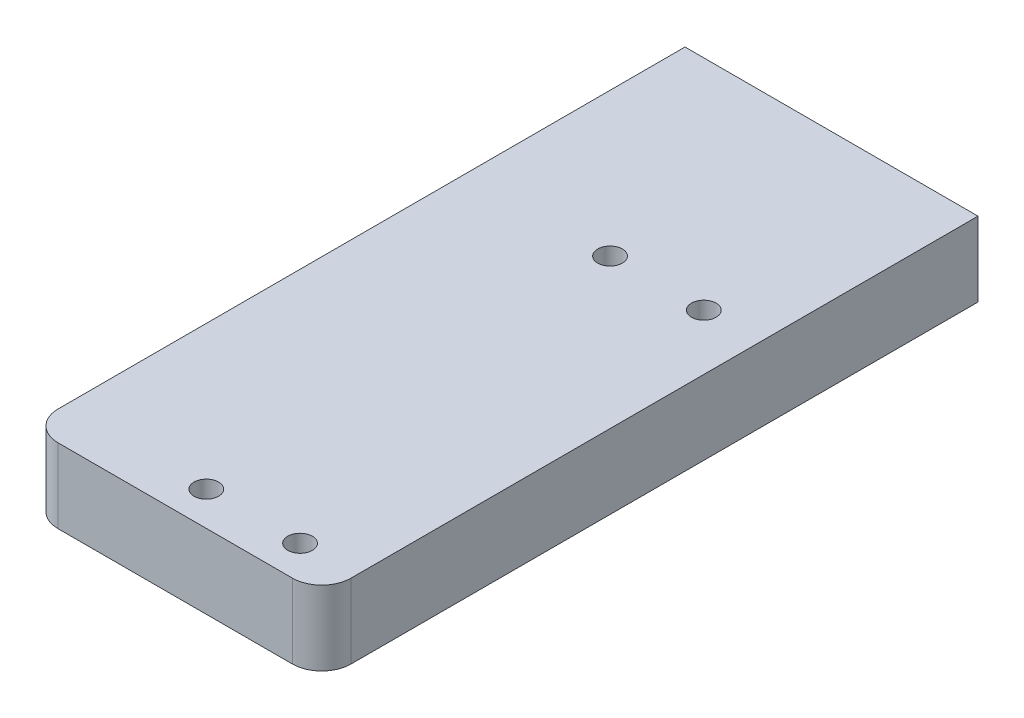
ISO-10303-21;
HEADER;
FILE_DESCRIPTION(('STEP AP214'),'2;1');
FILE_NAME('part.step','',(''),(''),'','','');
FILE_SCHEMA(('AUTOMOTIVE_DESIGN { 1 0 10303 214 1 1 1 1 }'));
ENDSEC;
DATA;
#1=APPLICATION_CONTEXT('core data for automotive mechanical design processes');
#2=APPLICATION_PROTOCOL_DEFINITION('international standard','automotive_design',2000,#1);
#3=PRODUCT_CONTEXT('',#1,'mechanical');
#4=PRODUCT('Part','Part','',(#3));
#5=PRODUCT_RELATED_PRODUCT_CATEGORY('part','',(#4));
#6=PRODUCT_DEFINITION_FORMATION('','',#4);
#7=PRODUCT_DEFINITION_CONTEXT('part definition',#1,'design');
#8=PRODUCT_DEFINITION('design','',#6,#7);
#9=PRODUCT_DEFINITION_SHAPE('','',#8);
#10=(LENGTH_UNIT() NAMED_UNIT(*) SI_UNIT(.MILLI.,.METRE.));
#11=(NAMED_UNIT(*) PLANE_ANGLE_UNIT() SI_UNIT($,.RADIAN.));
#12=(NAMED_UNIT(*) SI_UNIT($,.STERADIAN.) SOLID_ANGLE_UNIT());
#13=UNCERTAINTY_MEASURE_WITH_UNIT(LENGTH_MEASURE(1.E-05),#10,'distance_accuracy_value','');
#14=(GEOMETRIC_REPRESENTATION_CONTEXT(3) GLOBAL_UNCERTAINTY_ASSIGNED_CONTEXT((#13)) GLOBAL_UNIT_ASSIGNED_CONTEXT((#10,
#11,#12)) REPRESENTATION_CONTEXT('',''));
#15=CARTESIAN_POINT('',(0.,0.,0.));
#16=DIRECTION('',(0.,0.,1.));
#17=DIRECTION('',(1.,0.,0.));
#18=AXIS2_PLACEMENT_3D('',#15,#16,#17);
#19=CARTESIAN_POINT('',(-25.,-6.35000000000008,112.));
#20=DIRECTION('',(0.,1.00000000000002,0.));
#21=DIRECTION('',(0.,0.,1.));
#22=AXIS2_PLACEMENT_3D('',#19,#20,#21);
#23=PLANE('',#22);
#24=DIRECTION('',(1.00000000000002,0.,0.));
#25=VECTOR('',#24,1.);
#26=CARTESIAN_POINT('',(-25.,-6.35000000000008,112.));
#27=LINE('',#26,#25);
#28=CARTESIAN_POINT('',(-20.,-6.35000000000008,112.));
#29=VERTEX_POINT('',#28);
#30=CARTESIAN_POINT('',(20.,-6.35000000000008,112.));
#31=VERTEX_POINT('',#30);
#32=EDGE_CURVE('E192',#29,#31,#27,.T.);
#33=ORIENTED_EDGE('',*,*,#32,.F.);
#34=CARTESIAN_POINT('',(-20.,-6.35000000000008,107.));
#35=DIRECTION('',(0.,1.00000000000002,0.));
#36=DIRECTION('',(0.,0.,1.));
#37=AXIS2_PLACEMENT_3D('',#34,#35,#36);
#38=CIRCLE('',#37,5.);
#39=CARTESIAN_POINT('',(-25.,-6.35000000000008,107.));
#40=VERTEX_POINT('',#39);
#41=EDGE_CURVE('E222',#29,#40,#38,.F.);
#42=ORIENTED_EDGE('',*,*,#41,.T.);
#43=DIRECTION('',(0.,0.,-1.));
#44=VECTOR('',#43,1.);
#45=CARTESIAN_POINT('',(-25.,-6.35000000000008,112.));
#46=LINE('',#45,#44);
#47=CARTESIAN_POINT('',(-24.9999999999969,-6.35000000000008,-3.10862446895044E-12));
#48=VERTEX_POINT('',#47);
#49=EDGE_CURVE('E208',#40,#48,#46,.T.);
#50=ORIENTED_EDGE('',*,*,#49,.T.);
#51=DIRECTION('',(1.00000000000002,0.,0.));
#52=VECTOR('',#51,1.);
#53=CARTESIAN_POINT('',(-24.9999999999969,-6.35000000000008,-3.10862446895044E-12));
#54=LINE('',#53,#52);
#55=CARTESIAN_POINT('',(25.0000000000031,-6.35000000000008,0.));
#56=VERTEX_POINT('',#55);
#57=EDGE_CURVE('E193',#48,#56,#54,.T.);
#58=ORIENTED_EDGE('',*,*,#57,.T.);
#59=DIRECTION('',(0.,0.,-1.));
#60=VECTOR('',#59,1.);
#61=CARTESIAN_POINT('',(25.0000000000001,-6.35000000000008,112.));
#62=LINE('',#61,#60);
#63=CARTESIAN_POINT('',(25.0000000000031,-6.35000000000008,107.));
#64=VERTEX_POINT('',#63);
#65=EDGE_CURVE('E196',#64,#56,#62,.T.);
#66=ORIENTED_EDGE('',*,*,#65,.F.);
#67=CARTESIAN_POINT('',(20.0000000000031,-6.35000000000008,107.));
#68=DIRECTION('',(0.,1.00000000000002,0.));
#69=DIRECTION('',(0.,0.,1.));
#70=AXIS2_PLACEMENT_3D('',#67,#68,#69);
#71=CIRCLE('',#70,5.);
#72=EDGE_CURVE('E220',#64,#31,#71,.F.);
#73=ORIENTED_EDGE('',*,*,#72,.T.);
#74=EDGE_LOOP('',(#33,#42,#50,#58,#66,#73));
#75=FACE_BOUND('',#74,.T.);
#76=CARTESIAN_POINT('',(-0.499999999997613,-6.35000000000008,106.200000000001));
#77=DIRECTION('',(0.,1.00000000000002,0.));
#78=DIRECTION('',(0.,0.,1.));
#79=AXIS2_PLACEMENT_3D('',#76,#77,#78);
#80=CIRCLE('',#79,2.1);
#81=CARTESIAN_POINT('',(-0.499999999997613,-6.35000000000008,108.300000000001));
#82=VERTEX_POINT('',#81);
#83=EDGE_CURVE('E176',#82,#82,#80,.T.);
#84=ORIENTED_EDGE('',*,*,#83,.T.);
#85=EDGE_LOOP('',(#84));
#86=FACE_BOUND('',#85,.T.);
#87=CARTESIAN_POINT('',(15.5000000000055,-6.35000000000008,106.200000000001));
#88=DIRECTION('',(0.,1.00000000000002,0.));
#89=DIRECTION('',(0.,0.,1.));
#90=AXIS2_PLACEMENT_3D('',#87,#88,#89);
#91=CIRCLE('',#90,2.1);
#92=CARTESIAN_POINT('',(15.5000000000055,-6.35000000000008,108.300000000001));
#93=VERTEX_POINT('',#92);
#94=EDGE_CURVE('E310',#93,#93,#91,.T.);
#95=ORIENTED_EDGE('',*,*,#94,.T.);
#96=EDGE_LOOP('',(#95));
#97=FACE_BOUND('',#96,.T.);
#98=CARTESIAN_POINT('',(15.5000000000023,-6.35000000000008,37.3000000000008));
#99=DIRECTION('',(0.,1.00000000000002,0.));
#100=DIRECTION('',(0.,0.,1.));
#101=AXIS2_PLACEMENT_3D('',#98,#99,#100);
#102=CIRCLE('',#101,2.1);
#103=CARTESIAN_POINT('',(15.5000000000023,-6.35000000000008,39.4000000000008));
#104=VERTEX_POINT('',#103);
#105=EDGE_CURVE('E304',#104,#104,#102,.T.);
#106=ORIENTED_EDGE('',*,*,#105,.T.);
#107=EDGE_LOOP('',(#106));
#108=FACE_BOUND('',#107,.T.);
#109=CARTESIAN_POINT('',(-0.499999999997613,-6.35000000000008,37.3000000000007));
#110=DIRECTION('',(0.,1.00000000000002,0.));
#111=DIRECTION('',(0.,0.,1.));
#112=AXIS2_PLACEMENT_3D('',#109,#110,#111);
#113=CIRCLE('',#112,2.1);
#114=CARTESIAN_POINT('',(-0.499999999997613,-6.35000000000008,39.4000000000007));
#115=VERTEX_POINT('',#114);
#116=EDGE_CURVE('E298',#115,#115,#113,.T.);
#117=ORIENTED_EDGE('',*,*,#116,.T.);
#118=EDGE_LOOP('',(#117));
#119=FACE_BOUND('',#118,.T.);
#120=DIRECTION('',(-1.00000000000002,0.,0.));
#121=VECTOR('',#120,1.);
#122=CARTESIAN_POINT('',(-16.9999999999969,-6.35000000000008,45.3000000000009));
#123=LINE('',#122,#121);
#124=CARTESIAN_POINT('',(12.0000000000031,-6.35000000000008,45.3000000000008));
#125=VERTEX_POINT('',#124);
#126=CARTESIAN_POINT('',(-11.9999999999969,-6.35000000000008,45.3000000000009));
#127=VERTEX_POINT('',#126);
#128=EDGE_CURVE('E265',#125,#127,#123,.T.);
#129=ORIENTED_EDGE('',*,*,#128,.T.);
#130=CARTESIAN_POINT('',(-11.9999999999969,-6.35000000000008,50.300000000001));
#131=DIRECTION('',(0.,1.00000000000002,0.));
#132=DIRECTION('',(0.,0.,1.));
#133=AXIS2_PLACEMENT_3D('',#130,#131,#132);
#134=CIRCLE('',#133,5.);
#135=CARTESIAN_POINT('',(-16.9999999999969,-6.35000000000008,50.300000000001));
#136=VERTEX_POINT('',#135);
#137=EDGE_CURVE('E13',#127,#136,#134,.T.);
#138=ORIENTED_EDGE('',*,*,#137,.T.);
#139=DIRECTION('',(0.,0.,1.));
#140=VECTOR('',#139,1.);
#141=CARTESIAN_POINT('',(-16.9999999999969,-6.35000000000008,45.3000000000009));
#142=LINE('',#141,#140);
#143=CARTESIAN_POINT('',(-16.9999999999969,-6.35000000000008,93.2000000000009));
#144=VERTEX_POINT('',#143);
#145=EDGE_CURVE('E289',#136,#144,#142,.T.);
#146=ORIENTED_EDGE('',*,*,#145,.T.);
#147=CARTESIAN_POINT('',(-11.9999999999969,-6.35000000000008,93.2000000000009));
#148=DIRECTION('',(0.,1.00000000000002,0.));
#149=DIRECTION('',(0.,0.,1.));
#150=AXIS2_PLACEMENT_3D('',#147,#148,#149);
#151=CIRCLE('',#150,5.);
#152=CARTESIAN_POINT('',(-11.9999999999969,-6.35000000000008,98.2000000000009));
#153=VERTEX_POINT('',#152);
#154=EDGE_CURVE('E258',#144,#153,#151,.T.);
#155=ORIENTED_EDGE('',*,*,#154,.T.);
#156=DIRECTION('',(1.00000000000002,0.,0.));
#157=VECTOR('',#156,1.);
#158=CARTESIAN_POINT('',(-16.9999999999969,-6.35000000000008,98.2000000000009));
#159=LINE('',#158,#157);
#160=CARTESIAN_POINT('',(12.0000000000031,-6.35000000000008,98.2000000000008));
#161=VERTEX_POINT('',#160);
#162=EDGE_CURVE('E292',#153,#161,#159,.T.);
#163=ORIENTED_EDGE('',*,*,#162,.T.);
#164=CARTESIAN_POINT('',(12.0000000000031,-6.35000000000008,93.2000000000008));
#165=DIRECTION('',(0.,1.00000000000002,0.));
#166=DIRECTION('',(0.,0.,1.));
#167=AXIS2_PLACEMENT_3D('',#164,#165,#166);
#168=CIRCLE('',#167,5.);
#169=CARTESIAN_POINT('',(17.0000000000031,-6.35000000000008,93.2000000000008));
#170=VERTEX_POINT('',#169);
#171=EDGE_CURVE('E260',#161,#170,#168,.T.);
#172=ORIENTED_EDGE('',*,*,#171,.T.);
#173=DIRECTION('',(0.,0.,-1.));
#174=VECTOR('',#173,1.);
#175=CARTESIAN_POINT('',(17.0000000000031,-6.35000000000008,45.3000000000008));
#176=LINE('',#175,#174);
#177=CARTESIAN_POINT('',(17.0000000000031,-6.35000000000008,50.3000000000008));
#178=VERTEX_POINT('',#177);
#179=EDGE_CURVE('E266',#170,#178,#176,.T.);
#180=ORIENTED_EDGE('',*,*,#179,.T.);
#181=CARTESIAN_POINT('',(12.0000000000031,-6.35000000000008,50.3000000000008));
#182=DIRECTION('',(0.,1.00000000000002,0.));
#183=DIRECTION('',(0.,0.,1.));
#184=AXIS2_PLACEMENT_3D('',#181,#182,#183);
#185=CIRCLE('',#184,5.);
#186=EDGE_CURVE('E58',#178,#125,#185,.T.);
#187=ORIENTED_EDGE('',*,*,#186,.T.);
#188=EDGE_LOOP('',(#129,#138,#146,#155,#163,#172,#180,#187));
#189=FACE_BOUND('',#188,.T.);
#190=ADVANCED_FACE('F50',(#75,#86,#97,#108,#119,#189),#23,.F.);
#191=CARTESIAN_POINT('',(25.0000000000001,-6.35000000000008,112.));
#192=DIRECTION('',(-1.00000000000002,0.,0.));
#193=DIRECTION('',(0.,0.,1.));
#194=AXIS2_PLACEMENT_3D('',#191,#192,#193);
#195=PLANE('',#194);
#196=DIRECTION('',(0.,0.,-1.));
#197=VECTOR('',#196,1.);
#198=CARTESIAN_POINT('',(25.0000000000031,6.35000000000008,112.));
#199=LINE('',#198,#197);
#200=CARTESIAN_POINT('',(25.0000000000031,6.35000000000008,107.));
#201=VERTEX_POINT('',#200);
#202=CARTESIAN_POINT('',(25.,6.35000000000008,0.));
#203=VERTEX_POINT('',#202);
#204=EDGE_CURVE('E212',#201,#203,#199,.T.);
#205=ORIENTED_EDGE('',*,*,#204,.F.);
#206=DIRECTION('',(0.,1.00000000000002,0.));
#207=VECTOR('',#206,1.);
#208=CARTESIAN_POINT('',(25.0000000000031,-6.35000000000008,107.));
#209=LINE('',#208,#207);
#210=EDGE_CURVE('E230',#201,#64,#209,.F.);
#211=ORIENTED_EDGE('',*,*,#210,.T.);
#212=ORIENTED_EDGE('',*,*,#65,.T.);
#213=DIRECTION('',(0.,1.00000000000002,0.));
#214=VECTOR('',#213,1.);
#215=CARTESIAN_POINT('',(25.0000000000031,-6.35000000000008,0.));
#216=LINE('',#215,#214);
#217=EDGE_CURVE('E188',#56,#203,#216,.T.);
#218=ORIENTED_EDGE('',*,*,#217,.T.);
#219=EDGE_LOOP('',(#205,#211,#212,#218));
#220=FACE_BOUND('',#219,.T.);
#221=ADVANCED_FACE('F331',(#220),#195,.F.);
#222=CARTESIAN_POINT('',(-25.,6.35000000000008,112.));
#223=DIRECTION('',(0.,-1.00000000000002,0.));
#224=DIRECTION('',(0.,0.,-1.));
#225=AXIS2_PLACEMENT_3D('',#222,#223,#224);
#226=PLANE('',#225);
#227=CARTESIAN_POINT('',(-0.499999999997613,6.35000000000008,37.3000000000007));
#228=DIRECTION('',(0.,1.00000000000002,0.));
#229=DIRECTION('',(0.,0.,1.));
#230=AXIS2_PLACEMENT_3D('',#227,#228,#229);
#231=CIRCLE('',#230,2.1);
#232=CARTESIAN_POINT('',(-0.499999999997613,6.35000000000008,39.4000000000007));
#233=VERTEX_POINT('',#232);
#234=EDGE_CURVE('E283',#233,#233,#231,.T.);
#235=ORIENTED_EDGE('',*,*,#234,.F.);
#236=EDGE_LOOP('',(#235));
#237=FACE_BOUND('',#236,.T.);
#238=CARTESIAN_POINT('',(15.5000000000024,6.35000000000008,37.3000000000008));
#239=DIRECTION('',(0.,1.00000000000002,0.));
#240=DIRECTION('',(0.,0.,1.));
#241=AXIS2_PLACEMENT_3D('',#238,#239,#240);
#242=CIRCLE('',#241,2.1);
#243=CARTESIAN_POINT('',(15.5000000000024,6.35000000000008,39.4000000000008));
#244=VERTEX_POINT('',#243);
#245=EDGE_CURVE('E301',#244,#244,#242,.T.);
#246=ORIENTED_EDGE('',*,*,#245,.F.);
#247=EDGE_LOOP('',(#246));
#248=FACE_BOUND('',#247,.T.);
#249=CARTESIAN_POINT('',(15.5000000000055,6.35000000000008,106.200000000001));
#250=DIRECTION('',(0.,1.00000000000002,0.));
#251=DIRECTION('',(0.,0.,1.));
#252=AXIS2_PLACEMENT_3D('',#249,#250,#251);
#253=CIRCLE('',#252,2.1);
#254=CARTESIAN_POINT('',(15.5000000000055,6.35000000000008,108.300000000001));
#255=VERTEX_POINT('',#254);
#256=EDGE_CURVE('E307',#255,#255,#253,.T.);
#257=ORIENTED_EDGE('',*,*,#256,.F.);
#258=EDGE_LOOP('',(#257));
#259=FACE_BOUND('',#258,.T.);
#260=CARTESIAN_POINT('',(-0.49999999999456,6.35000000000008,106.200000000001));
#261=DIRECTION('',(0.,1.00000000000002,0.));
#262=DIRECTION('',(0.,0.,1.));
#263=AXIS2_PLACEMENT_3D('',#260,#261,#262);
#264=CIRCLE('',#263,2.1);
#265=CARTESIAN_POINT('',(-0.49999999999456,6.35000000000008,108.300000000001));
#266=VERTEX_POINT('',#265);
#267=EDGE_CURVE('E313',#266,#266,#264,.T.);
#268=ORIENTED_EDGE('',*,*,#267,.F.);
#269=EDGE_LOOP('',(#268));
#270=FACE_BOUND('',#269,.T.);
#271=DIRECTION('',(0.,0.,-1.));
#272=VECTOR('',#271,1.);
#273=CARTESIAN_POINT('',(-25.,6.35000000000008,112.));
#274=LINE('',#273,#272);
#275=CARTESIAN_POINT('',(-24.9999999999969,6.35000000000008,107.));
#276=VERTEX_POINT('',#275);
#277=CARTESIAN_POINT('',(-25.,6.35000000000008,-3.10862446895044E-12));
#278=VERTEX_POINT('',#277);
#279=EDGE_CURVE('E210',#276,#278,#274,.T.);
#280=ORIENTED_EDGE('',*,*,#279,.F.);
#281=CARTESIAN_POINT('',(-19.9999999999969,6.35000000000008,107.));
#282=DIRECTION('',(0.,-1.00000000000002,0.));
#283=DIRECTION('',(0.,0.,-1.));
#284=AXIS2_PLACEMENT_3D('',#281,#282,#283);
#285=CIRCLE('',#284,5.);
#286=CARTESIAN_POINT('',(-19.9999999999969,6.35000000000008,112.));
#287=VERTEX_POINT('',#286);
#288=EDGE_CURVE('E228',#276,#287,#285,.F.);
#289=ORIENTED_EDGE('',*,*,#288,.T.);
#290=DIRECTION('',(-1.00000000000002,0.,0.));
#291=VECTOR('',#290,1.);
#292=CARTESIAN_POINT('',(-25.,6.35000000000008,112.));
#293=LINE('',#292,#291);
#294=CARTESIAN_POINT('',(20.0000000000031,6.35000000000008,112.));
#295=VERTEX_POINT('',#294);
#296=EDGE_CURVE('E189',#295,#287,#293,.T.);
#297=ORIENTED_EDGE('',*,*,#296,.F.);
#298=CARTESIAN_POINT('',(20.0000000000031,6.35000000000008,107.));
#299=DIRECTION('',(0.,-1.00000000000002,0.));
#300=DIRECTION('',(0.,0.,-1.));
#301=AXIS2_PLACEMENT_3D('',#298,#299,#300);
#302=CIRCLE('',#301,5.);
#303=EDGE_CURVE('E226',#295,#201,#302,.F.);
#304=ORIENTED_EDGE('',*,*,#303,.T.);
#305=ORIENTED_EDGE('',*,*,#204,.T.);
#306=DIRECTION('',(-1.00000000000002,0.,0.));
#307=VECTOR('',#306,1.);
#308=CARTESIAN_POINT('',(-25.,6.35000000000008,-3.10862446895044E-12));
#309=LINE('',#308,#307);
#310=EDGE_CURVE('E199',#203,#278,#309,.T.);
#311=ORIENTED_EDGE('',*,*,#310,.T.);
#312=EDGE_LOOP('',(#280,#289,#297,#304,#305,#311));
#313=FACE_BOUND('',#312,.T.);
#314=ADVANCED_FACE('F327',(#237,#248,#259,#270,#313),#226,.F.);
#315=CARTESIAN_POINT('',(-25.,-6.35000000000008,112.));
#316=DIRECTION('',(1.00000000000002,0.,0.));
#317=DIRECTION('',(0.,0.,-1.));
#318=AXIS2_PLACEMENT_3D('',#315,#316,#317);
#319=PLANE('',#318);
#320=ORIENTED_EDGE('',*,*,#49,.F.);
#321=DIRECTION('',(0.,-1.00000000000002,0.));
#322=VECTOR('',#321,1.);
#323=CARTESIAN_POINT('',(-25.,-6.35000000000008,107.));
#324=LINE('',#323,#322);
#325=EDGE_CURVE('E224',#40,#276,#324,.F.);
#326=ORIENTED_EDGE('',*,*,#325,.T.);
#327=ORIENTED_EDGE('',*,*,#279,.T.);
#328=DIRECTION('',(0.,-1.00000000000002,0.));
#329=VECTOR('',#328,1.);
#330=CARTESIAN_POINT('',(-24.9999999999969,-6.35000000000008,-3.10862446895044E-12));
#331=LINE('',#330,#329);
#332=EDGE_CURVE('E202',#278,#48,#331,.T.);
#333=ORIENTED_EDGE('',*,*,#332,.T.);
#334=EDGE_LOOP('',(#320,#326,#327,#333));
#335=FACE_BOUND('',#334,.T.);
#336=ADVANCED_FACE('F330',(#335),#319,.F.);
#337=CARTESIAN_POINT('',(0.,0.,112.));
#338=DIRECTION('',(0.,0.,-1.));
#339=DIRECTION('',(-1.00000000000002,0.,0.));
#340=AXIS2_PLACEMENT_3D('',#337,#338,#339);
#341=PLANE('',#340);
#342=ORIENTED_EDGE('',*,*,#296,.T.);
#343=DIRECTION('',(0.,-1.00000000000002,0.));
#344=VECTOR('',#343,1.);
#345=CARTESIAN_POINT('',(-20.,0.,112.));
#346=LINE('',#345,#344);
#347=EDGE_CURVE('E217',#287,#29,#346,.T.);
#348=ORIENTED_EDGE('',*,*,#347,.T.);
#349=ORIENTED_EDGE('',*,*,#32,.T.);
#350=DIRECTION('',(0.,1.00000000000002,0.));
#351=VECTOR('',#350,1.);
#352=CARTESIAN_POINT('',(20.0000000000031,0.,112.));
#353=LINE('',#352,#351);
#354=EDGE_CURVE('E214',#31,#295,#353,.T.);
#355=ORIENTED_EDGE('',*,*,#354,.T.);
#356=EDGE_LOOP('',(#342,#348,#349,#355));
#357=FACE_BOUND('',#356,.T.);
#358=ADVANCED_FACE('F346',(#357),#341,.F.);
#359=CARTESIAN_POINT('',(0.,0.,0.));
#360=DIRECTION('',(0.,0.,-1.));
#361=DIRECTION('',(-1.00000000000002,0.,0.));
#362=AXIS2_PLACEMENT_3D('',#359,#360,#361);
#363=PLANE('',#362);
#364=CARTESIAN_POINT('',(17.5,0.,-3.10862446895044E-12));
#365=DIRECTION('',(0.,0.,-1.));
#366=DIRECTION('',(-1.00000000000002,0.,0.));
#367=AXIS2_PLACEMENT_3D('',#364,#365,#366);
#368=CIRCLE('',#367,2.1);
#369=CARTESIAN_POINT('',(15.4,0.,-3.10862446895044E-12));
#370=VERTEX_POINT('',#369);
#371=EDGE_CURVE('E170',#370,#370,#368,.T.);
#372=ORIENTED_EDGE('',*,*,#371,.F.);
#373=EDGE_LOOP('',(#372));
#374=FACE_BOUND('',#373,.T.);
#375=CARTESIAN_POINT('',(0.,0.,0.));
#376=DIRECTION('',(0.,0.,-1.));
#377=DIRECTION('',(-1.00000000000002,0.,0.));
#378=AXIS2_PLACEMENT_3D('',#375,#376,#377);
#379=CIRCLE('',#378,2.1);
#380=CARTESIAN_POINT('',(-2.10000000000005,0.,0.));
#381=VERTEX_POINT('',#380);
#382=EDGE_CURVE('E169',#381,#381,#379,.T.);
#383=ORIENTED_EDGE('',*,*,#382,.F.);
#384=EDGE_LOOP('',(#383));
#385=FACE_BOUND('',#384,.T.);
#386=CARTESIAN_POINT('',(-17.5,0.,0.));
#387=DIRECTION('',(0.,0.,-1.));
#388=DIRECTION('',(-1.00000000000002,0.,0.));
#389=AXIS2_PLACEMENT_3D('',#386,#387,#388);
#390=CIRCLE('',#389,2.1);
#391=CARTESIAN_POINT('',(-19.6000000000001,0.,0.));
#392=VERTEX_POINT('',#391);
#393=EDGE_CURVE('E182',#392,#392,#390,.T.);
#394=ORIENTED_EDGE('',*,*,#393,.F.);
#395=EDGE_LOOP('',(#394));
#396=FACE_BOUND('',#395,.T.);
#397=ORIENTED_EDGE('',*,*,#217,.F.);
#398=ORIENTED_EDGE('',*,*,#57,.F.);
#399=ORIENTED_EDGE('',*,*,#332,.F.);
#400=ORIENTED_EDGE('',*,*,#310,.F.);
#401=EDGE_LOOP('',(#397,#398,#399,#400));
#402=FACE_BOUND('',#401,.T.);
#403=ADVANCED_FACE('F360',(#374,#385,#396,#402),#363,.T.);
#404=CARTESIAN_POINT('',(-17.4999999999969,0.,14.4));
#405=DIRECTION('',(0.,0.,-1.));
#406=DIRECTION('',(-1.00000000000002,0.,0.));
#407=AXIS2_PLACEMENT_3D('',#404,#405,#406);
#408=CONICAL_SURFACE('',#407,2.1,1.02974425867665);
#409=CARTESIAN_POINT('',(-17.4999999999969,0.,15.6618072999579));
#410=VERTEX_POINT('',#409);
#411=VERTEX_LOOP('',#410);
#412=FACE_BOUND('',#411,.T.);
#413=CARTESIAN_POINT('',(-17.4999999999969,0.,14.4));
#414=DIRECTION('',(0.,0.,-1.));
#415=DIRECTION('',(-1.00000000000002,0.,0.));
#416=AXIS2_PLACEMENT_3D('',#413,#414,#415);
#417=CIRCLE('',#416,2.1);
#418=CARTESIAN_POINT('',(-19.599999999997,0.,14.4));
#419=VERTEX_POINT('',#418);
#420=EDGE_CURVE('E185',#419,#419,#417,.T.);
#421=ORIENTED_EDGE('',*,*,#420,.T.);
#422=EDGE_LOOP('',(#421));
#423=FACE_BOUND('',#422,.T.);
#424=ADVANCED_FACE('F375',(#412,#423),#408,.F.);
#425=CARTESIAN_POINT('',(-17.5,0.,0.));
#426=DIRECTION('',(0.,0.,-1.));
#427=DIRECTION('',(-1.00000000000002,0.,0.));
#428=AXIS2_PLACEMENT_3D('',#425,#426,#427);
#429=CYLINDRICAL_SURFACE('',#428,2.1);
#430=ORIENTED_EDGE('',*,*,#420,.F.);
#431=EDGE_LOOP('',(#430));
#432=FACE_BOUND('',#431,.T.);
#433=ORIENTED_EDGE('',*,*,#393,.T.);
#434=EDGE_LOOP('',(#433));
#435=FACE_BOUND('',#434,.T.);
#436=ADVANCED_FACE('F380',(#432,#435),#429,.F.);
#437=CARTESIAN_POINT('',(3.10862446895044E-12,0.,14.4));
#438=DIRECTION('',(0.,0.,-1.));
#439=DIRECTION('',(-1.00000000000002,0.,0.));
#440=AXIS2_PLACEMENT_3D('',#437,#438,#439);
#441=CONICAL_SURFACE('',#440,2.1,1.02974425867665);
#442=CARTESIAN_POINT('',(3.10862446895044E-12,0.,15.6618072999579));
#443=VERTEX_POINT('',#442);
#444=VERTEX_LOOP('',#443);
#445=FACE_BOUND('',#444,.T.);
#446=CARTESIAN_POINT('',(3.10862446895044E-12,0.,14.4));
#447=DIRECTION('',(0.,0.,-1.));
#448=DIRECTION('',(-1.00000000000002,0.,0.));
#449=AXIS2_PLACEMENT_3D('',#446,#447,#448);
#450=CIRCLE('',#449,2.1);
#451=CARTESIAN_POINT('',(-2.09999999999694,0.,14.4));
#452=VERTEX_POINT('',#451);
#453=EDGE_CURVE('E173',#452,#452,#450,.T.);
#454=ORIENTED_EDGE('',*,*,#453,.T.);
#455=EDGE_LOOP('',(#454));
#456=FACE_BOUND('',#455,.T.);
#457=ADVANCED_FACE('F384',(#445,#456),#441,.F.);
#458=CARTESIAN_POINT('',(0.,0.,0.));
#459=DIRECTION('',(0.,0.,-1.));
#460=DIRECTION('',(-1.00000000000002,0.,0.));
#461=AXIS2_PLACEMENT_3D('',#458,#459,#460);
#462=CYLINDRICAL_SURFACE('',#461,2.1);
#463=ORIENTED_EDGE('',*,*,#453,.F.);
#464=EDGE_LOOP('',(#463));
#465=FACE_BOUND('',#464,.T.);
#466=ORIENTED_EDGE('',*,*,#382,.T.);
#467=EDGE_LOOP('',(#466));
#468=FACE_BOUND('',#467,.T.);
#469=ADVANCED_FACE('F163',(#465,#468),#462,.F.);
#470=CARTESIAN_POINT('',(17.5000000000031,0.,14.3999999999969));
#471=DIRECTION('',(0.,0.,-1.));
#472=DIRECTION('',(-1.00000000000002,0.,0.));
#473=AXIS2_PLACEMENT_3D('',#470,#471,#472);
#474=CONICAL_SURFACE('',#473,2.1,1.02974425867665);
#475=CARTESIAN_POINT('',(17.5000000000031,0.,15.6618072999548));
#476=VERTEX_POINT('',#475);
#477=VERTEX_LOOP('',#476);
#478=FACE_BOUND('',#477,.T.);
#479=CARTESIAN_POINT('',(17.5000000000031,0.,14.3999999999969));
#480=DIRECTION('',(0.,0.,-1.));
#481=DIRECTION('',(-1.00000000000002,0.,0.));
#482=AXIS2_PLACEMENT_3D('',#479,#480,#481);
#483=CIRCLE('',#482,2.1);
#484=CARTESIAN_POINT('',(15.400000000003,0.,14.3999999999969));
#485=VERTEX_POINT('',#484);
#486=EDGE_CURVE('E167',#485,#485,#483,.T.);
#487=ORIENTED_EDGE('',*,*,#486,.T.);
#488=EDGE_LOOP('',(#487));
#489=FACE_BOUND('',#488,.T.);
#490=ADVANCED_FACE('F159',(#478,#489),#474,.F.);
#491=CARTESIAN_POINT('',(17.5,0.,-3.10862446895044E-12));
#492=DIRECTION('',(0.,0.,-1.));
#493=DIRECTION('',(-1.00000000000002,0.,0.));
#494=AXIS2_PLACEMENT_3D('',#491,#492,#493);
#495=CYLINDRICAL_SURFACE('',#494,2.1);
#496=ORIENTED_EDGE('',*,*,#486,.F.);
#497=EDGE_LOOP('',(#496));
#498=FACE_BOUND('',#497,.T.);
#499=ORIENTED_EDGE('',*,*,#371,.T.);
#500=EDGE_LOOP('',(#499));
#501=FACE_BOUND('',#500,.T.);
#502=ADVANCED_FACE('F162',(#498,#501),#495,.F.);
#503=CARTESIAN_POINT('',(-0.49999999999456,6.35000000000008,106.200000000001));
#504=DIRECTION('',(0.,1.00000000000002,0.));
#505=DIRECTION('',(0.,0.,1.));
#506=AXIS2_PLACEMENT_3D('',#503,#504,#505);
#507=CYLINDRICAL_SURFACE('',#506,2.1);
#508=ORIENTED_EDGE('',*,*,#83,.F.);
#509=EDGE_LOOP('',(#508));
#510=FACE_BOUND('',#509,.T.);
#511=ORIENTED_EDGE('',*,*,#267,.T.);
#512=EDGE_LOOP('',(#511));
#513=FACE_BOUND('',#512,.T.);
#514=ADVANCED_FACE('F320',(#510,#513),#507,.F.);
#515=CARTESIAN_POINT('',(15.5000000000055,6.35000000000008,106.200000000001));
#516=DIRECTION('',(0.,1.00000000000002,0.));
#517=DIRECTION('',(0.,0.,1.));
#518=AXIS2_PLACEMENT_3D('',#515,#516,#517);
#519=CYLINDRICAL_SURFACE('',#518,2.1);
#520=ORIENTED_EDGE('',*,*,#94,.F.);
#521=EDGE_LOOP('',(#520));
#522=FACE_BOUND('',#521,.T.);
#523=ORIENTED_EDGE('',*,*,#256,.T.);
#524=EDGE_LOOP('',(#523));
#525=FACE_BOUND('',#524,.T.);
#526=ADVANCED_FACE('F323',(#522,#525),#519,.F.);
#527=CARTESIAN_POINT('',(15.5000000000024,6.35000000000008,37.3000000000008));
#528=DIRECTION('',(0.,1.00000000000002,0.));
#529=DIRECTION('',(0.,0.,1.));
#530=AXIS2_PLACEMENT_3D('',#527,#528,#529);
#531=CYLINDRICAL_SURFACE('',#530,2.1);
#532=ORIENTED_EDGE('',*,*,#105,.F.);
#533=EDGE_LOOP('',(#532));
#534=FACE_BOUND('',#533,.T.);
#535=ORIENTED_EDGE('',*,*,#245,.T.);
#536=EDGE_LOOP('',(#535));
#537=FACE_BOUND('',#536,.T.);
#538=ADVANCED_FACE('F396',(#534,#537),#531,.F.);
#539=CARTESIAN_POINT('',(-0.499999999997613,6.35000000000008,37.3000000000007));
#540=DIRECTION('',(0.,1.00000000000002,0.));
#541=DIRECTION('',(0.,0.,1.));
#542=AXIS2_PLACEMENT_3D('',#539,#540,#541);
#543=CYLINDRICAL_SURFACE('',#542,2.1);
#544=ORIENTED_EDGE('',*,*,#116,.F.);
#545=EDGE_LOOP('',(#544));
#546=FACE_BOUND('',#545,.T.);
#547=ORIENTED_EDGE('',*,*,#234,.T.);
#548=EDGE_LOOP('',(#547));
#549=FACE_BOUND('',#548,.T.);
#550=ADVANCED_FACE('F400',(#546,#549),#543,.F.);
#551=CARTESIAN_POINT('',(-17.,3.34999999999996,45.3000000000009));
#552=DIRECTION('',(1.00000000000002,0.,0.));
#553=DIRECTION('',(0.,0.,-1.));
#554=AXIS2_PLACEMENT_3D('',#551,#552,#553);
#555=PLANE('',#554);
#556=DIRECTION('',(0.,0.,1.));
#557=VECTOR('',#556,1.);
#558=CARTESIAN_POINT('',(-17.,3.34999999999996,45.3000000000009));
#559=LINE('',#558,#557);
#560=CARTESIAN_POINT('',(-16.9999999999969,3.34999999999996,50.300000000001));
#561=VERTEX_POINT('',#560);
#562=CARTESIAN_POINT('',(-17.,3.34999999999996,93.2000000000009));
#563=VERTEX_POINT('',#562);
#564=EDGE_CURVE('E274',#561,#563,#559,.T.);
#565=ORIENTED_EDGE('',*,*,#564,.T.);
#566=DIRECTION('',(0.,-1.00000000000002,0.));
#567=VECTOR('',#566,1.);
#568=CARTESIAN_POINT('',(-16.9999999999969,-6.35000000000008,93.2000000000009));
#569=LINE('',#568,#567);
#570=EDGE_CURVE('E234',#563,#144,#569,.T.);
#571=ORIENTED_EDGE('',*,*,#570,.T.);
#572=ORIENTED_EDGE('',*,*,#145,.F.);
#573=DIRECTION('',(0.,-1.00000000000002,0.));
#574=VECTOR('',#573,1.);
#575=CARTESIAN_POINT('',(-16.9999999999969,3.34999999999996,50.300000000001));
#576=LINE('',#575,#574);
#577=EDGE_CURVE('E232',#136,#561,#576,.F.);
#578=ORIENTED_EDGE('',*,*,#577,.T.);
#579=EDGE_LOOP('',(#565,#571,#572,#578));
#580=FACE_BOUND('',#579,.T.);
#581=ADVANCED_FACE('F404',(#580),#555,.T.);
#582=CARTESIAN_POINT('',(-16.9999999999969,3.34999999999996,98.2000000000009));
#583=DIRECTION('',(0.,0.,-1.));
#584=DIRECTION('',(-1.00000000000002,0.,0.));
#585=AXIS2_PLACEMENT_3D('',#582,#583,#584);
#586=PLANE('',#585);
#587=ORIENTED_EDGE('',*,*,#162,.F.);
#588=DIRECTION('',(0.,-1.00000000000002,0.));
#589=VECTOR('',#588,1.);
#590=CARTESIAN_POINT('',(-11.9999999999969,3.34999999999996,98.2000000000009));
#591=LINE('',#590,#589);
#592=CARTESIAN_POINT('',(-11.9999999999969,3.34999999999996,98.2000000000009));
#593=VERTEX_POINT('',#592);
#594=EDGE_CURVE('E240',#153,#593,#591,.F.);
#595=ORIENTED_EDGE('',*,*,#594,.T.);
#596=DIRECTION('',(1.00000000000002,0.,0.));
#597=VECTOR('',#596,1.);
#598=CARTESIAN_POINT('',(-16.9999999999969,3.34999999999996,98.2000000000009));
#599=LINE('',#598,#597);
#600=CARTESIAN_POINT('',(12.0000000000031,3.34999999999996,98.2000000000008));
#601=VERTEX_POINT('',#600);
#602=EDGE_CURVE('E281',#593,#601,#599,.T.);
#603=ORIENTED_EDGE('',*,*,#602,.T.);
#604=DIRECTION('',(0.,-1.00000000000002,0.));
#605=VECTOR('',#604,1.);
#606=CARTESIAN_POINT('',(12.0000000000031,-6.35000000000008,98.2000000000008));
#607=LINE('',#606,#605);
#608=EDGE_CURVE('E237',#601,#161,#607,.T.);
#609=ORIENTED_EDGE('',*,*,#608,.T.);
#610=EDGE_LOOP('',(#587,#595,#603,#609));
#611=FACE_BOUND('',#610,.T.);
#612=ADVANCED_FACE('F408',(#611),#586,.T.);
#613=CARTESIAN_POINT('',(17.,3.34999999999996,45.3000000000008));
#614=DIRECTION('',(-1.00000000000002,0.,0.));
#615=DIRECTION('',(0.,0.,1.));
#616=AXIS2_PLACEMENT_3D('',#613,#614,#615);
#617=PLANE('',#616);
#618=ORIENTED_EDGE('',*,*,#179,.F.);
#619=DIRECTION('',(0.,-1.00000000000002,0.));
#620=VECTOR('',#619,1.);
#621=CARTESIAN_POINT('',(17.,3.34999999999996,93.2000000000008));
#622=LINE('',#621,#620);
#623=CARTESIAN_POINT('',(17.,3.34999999999996,93.2000000000008));
#624=VERTEX_POINT('',#623);
#625=EDGE_CURVE('E72',#170,#624,#622,.F.);
#626=ORIENTED_EDGE('',*,*,#625,.T.);
#627=DIRECTION('',(0.,0.,-1.));
#628=VECTOR('',#627,1.);
#629=CARTESIAN_POINT('',(17.,3.34999999999996,45.3000000000008));
#630=LINE('',#629,#628);
#631=CARTESIAN_POINT('',(17.0000000000031,3.34999999999996,50.3000000000008));
#632=VERTEX_POINT('',#631);
#633=EDGE_CURVE('E278',#624,#632,#630,.T.);
#634=ORIENTED_EDGE('',*,*,#633,.T.);
#635=DIRECTION('',(0.,-1.00000000000002,0.));
#636=VECTOR('',#635,1.);
#637=CARTESIAN_POINT('',(17.0000000000031,-6.35000000000008,50.3000000000008));
#638=LINE('',#637,#636);
#639=EDGE_CURVE('E249',#632,#178,#638,.T.);
#640=ORIENTED_EDGE('',*,*,#639,.T.);
#641=EDGE_LOOP('',(#618,#626,#634,#640));
#642=FACE_BOUND('',#641,.T.);
#643=ADVANCED_FACE('F277',(#642),#617,.T.);
#644=CARTESIAN_POINT('',(-17.,3.34999999999996,45.3000000000009));
#645=DIRECTION('',(0.,0.,1.));
#646=DIRECTION('',(1.00000000000002,0.,0.));
#647=AXIS2_PLACEMENT_3D('',#644,#645,#646);
#648=PLANE('',#647);
#649=ORIENTED_EDGE('',*,*,#128,.F.);
#650=DIRECTION('',(0.,-1.00000000000002,0.));
#651=VECTOR('',#650,1.);
#652=CARTESIAN_POINT('',(12.,3.34999999999996,45.3000000000008));
#653=LINE('',#652,#651);
#654=CARTESIAN_POINT('',(12.,3.34999999999996,45.3000000000008));
#655=VERTEX_POINT('',#654);
#656=EDGE_CURVE('E256',#125,#655,#653,.F.);
#657=ORIENTED_EDGE('',*,*,#656,.T.);
#658=DIRECTION('',(-1.00000000000002,0.,0.));
#659=VECTOR('',#658,1.);
#660=CARTESIAN_POINT('',(-17.,3.34999999999996,45.3000000000009));
#661=LINE('',#660,#659);
#662=CARTESIAN_POINT('',(-12.,3.34999999999996,45.3000000000009));
#663=VERTEX_POINT('',#662);
#664=EDGE_CURVE('E280',#655,#663,#661,.T.);
#665=ORIENTED_EDGE('',*,*,#664,.T.);
#666=DIRECTION('',(0.,-1.00000000000002,0.));
#667=VECTOR('',#666,1.);
#668=CARTESIAN_POINT('',(-11.9999999999969,-6.35000000000008,45.3000000000009));
#669=LINE('',#668,#667);
#670=EDGE_CURVE('E253',#663,#127,#669,.T.);
#671=ORIENTED_EDGE('',*,*,#670,.T.);
#672=EDGE_LOOP('',(#649,#657,#665,#671));
#673=FACE_BOUND('',#672,.T.);
#674=ADVANCED_FACE('F271',(#673),#648,.T.);
#675=CARTESIAN_POINT('',(0.,3.34999999999996,0.));
#676=DIRECTION('',(0.,1.00000000000002,0.));
#677=DIRECTION('',(0.,0.,1.));
#678=AXIS2_PLACEMENT_3D('',#675,#676,#677);
#679=PLANE('',#678);
#680=ORIENTED_EDGE('',*,*,#602,.F.);
#681=CARTESIAN_POINT('',(-12.,3.34999999999996,93.2000000000009));
#682=DIRECTION('',(0.,1.00000000000002,0.));
#683=DIRECTION('',(0.,0.,1.));
#684=AXIS2_PLACEMENT_3D('',#681,#682,#683);
#685=CIRCLE('',#684,5.);
#686=EDGE_CURVE('E247',#593,#563,#685,.F.);
#687=ORIENTED_EDGE('',*,*,#686,.T.);
#688=ORIENTED_EDGE('',*,*,#564,.F.);
#689=CARTESIAN_POINT('',(-11.9999999999969,3.34999999999996,50.300000000001));
#690=DIRECTION('',(0.,1.00000000000002,0.));
#691=DIRECTION('',(0.,0.,1.));
#692=AXIS2_PLACEMENT_3D('',#689,#690,#691);
#693=CIRCLE('',#692,5.);
#694=EDGE_CURVE('E242',#561,#663,#693,.F.);
#695=ORIENTED_EDGE('',*,*,#694,.T.);
#696=ORIENTED_EDGE('',*,*,#664,.F.);
#697=CARTESIAN_POINT('',(12.0000000000031,3.34999999999996,50.3000000000008));
#698=DIRECTION('',(0.,1.00000000000002,0.));
#699=DIRECTION('',(0.,0.,1.));
#700=AXIS2_PLACEMENT_3D('',#697,#698,#699);
#701=CIRCLE('',#700,5.);
#702=EDGE_CURVE('E65',#655,#632,#701,.F.);
#703=ORIENTED_EDGE('',*,*,#702,.T.);
#704=ORIENTED_EDGE('',*,*,#633,.F.);
#705=CARTESIAN_POINT('',(12.,3.34999999999996,93.2000000000008));
#706=DIRECTION('',(0.,1.00000000000002,0.));
#707=DIRECTION('',(0.,0.,1.));
#708=AXIS2_PLACEMENT_3D('',#705,#706,#707);
#709=CIRCLE('',#708,5.);
#710=EDGE_CURVE('E245',#624,#601,#709,.F.);
#711=ORIENTED_EDGE('',*,*,#710,.T.);
#712=EDGE_LOOP('',(#680,#687,#688,#695,#696,#703,#704,#711));
#713=FACE_BOUND('',#712,.T.);
#714=ADVANCED_FACE('F417',(#713),#679,.F.);
#715=CARTESIAN_POINT('',(-19.9999999999969,0.,107.));
#716=DIRECTION('',(0.,-1.00000000000002,0.));
#717=DIRECTION('',(0.,0.,-1.));
#718=AXIS2_PLACEMENT_3D('',#715,#716,#717);
#719=CYLINDRICAL_SURFACE('',#718,5.);
#720=ORIENTED_EDGE('',*,*,#288,.F.);
#721=ORIENTED_EDGE('',*,*,#325,.F.);
#722=ORIENTED_EDGE('',*,*,#41,.F.);
#723=ORIENTED_EDGE('',*,*,#347,.F.);
#724=EDGE_LOOP('',(#720,#721,#722,#723));
#725=FACE_BOUND('',#724,.T.);
#726=ADVANCED_FACE('F343',(#725),#719,.T.);
#727=CARTESIAN_POINT('',(20.0000000000031,0.,107.));
#728=DIRECTION('',(0.,1.00000000000002,0.));
#729=DIRECTION('',(0.,0.,1.));
#730=AXIS2_PLACEMENT_3D('',#727,#728,#729);
#731=CYLINDRICAL_SURFACE('',#730,5.);
#732=ORIENTED_EDGE('',*,*,#72,.F.);
#733=ORIENTED_EDGE('',*,*,#210,.F.);
#734=ORIENTED_EDGE('',*,*,#303,.F.);
#735=ORIENTED_EDGE('',*,*,#354,.F.);
#736=EDGE_LOOP('',(#732,#733,#734,#735));
#737=FACE_BOUND('',#736,.T.);
#738=ADVANCED_FACE('F354',(#737),#731,.T.);
#739=CARTESIAN_POINT('',(-12.,3.34999999999996,93.2000000000009));
#740=DIRECTION('',(0.,1.00000000000002,0.));
#741=DIRECTION('',(0.,0.,1.));
#742=AXIS2_PLACEMENT_3D('',#739,#740,#741);
#743=CYLINDRICAL_SURFACE('',#742,5.);
#744=ORIENTED_EDGE('',*,*,#686,.F.);
#745=ORIENTED_EDGE('',*,*,#594,.F.);
#746=ORIENTED_EDGE('',*,*,#154,.F.);
#747=ORIENTED_EDGE('',*,*,#570,.F.);
#748=EDGE_LOOP('',(#744,#745,#746,#747));
#749=FACE_BOUND('',#748,.T.);
#750=ADVANCED_FACE('F431',(#749),#743,.F.);
#751=CARTESIAN_POINT('',(12.,3.34999999999996,93.2000000000008));
#752=DIRECTION('',(0.,1.00000000000002,0.));
#753=DIRECTION('',(0.,0.,1.));
#754=AXIS2_PLACEMENT_3D('',#751,#752,#753);
#755=CYLINDRICAL_SURFACE('',#754,5.);
#756=ORIENTED_EDGE('',*,*,#710,.F.);
#757=ORIENTED_EDGE('',*,*,#625,.F.);
#758=ORIENTED_EDGE('',*,*,#171,.F.);
#759=ORIENTED_EDGE('',*,*,#608,.F.);
#760=EDGE_LOOP('',(#756,#757,#758,#759));
#761=FACE_BOUND('',#760,.T.);
#762=ADVANCED_FACE('F441',(#761),#755,.F.);
#763=CARTESIAN_POINT('',(12.0000000000031,3.34999999999996,50.3000000000008));
#764=DIRECTION('',(0.,1.00000000000002,0.));
#765=DIRECTION('',(0.,0.,1.));
#766=AXIS2_PLACEMENT_3D('',#763,#764,#765);
#767=CYLINDRICAL_SURFACE('',#766,5.);
#768=ORIENTED_EDGE('',*,*,#702,.F.);
#769=ORIENTED_EDGE('',*,*,#656,.F.);
#770=ORIENTED_EDGE('',*,*,#186,.F.);
#771=ORIENTED_EDGE('',*,*,#639,.F.);
#772=EDGE_LOOP('',(#768,#769,#770,#771));
#773=FACE_BOUND('',#772,.T.);
#774=ADVANCED_FACE('F276',(#773),#767,.F.);
#775=CARTESIAN_POINT('',(-11.9999999999969,3.34999999999996,50.300000000001));
#776=DIRECTION('',(0.,1.00000000000002,0.));
#777=DIRECTION('',(0.,0.,1.));
#778=AXIS2_PLACEMENT_3D('',#775,#776,#777);
#779=CYLINDRICAL_SURFACE('',#778,5.);
#780=ORIENTED_EDGE('',*,*,#694,.F.);
#781=ORIENTED_EDGE('',*,*,#577,.F.);
#782=ORIENTED_EDGE('',*,*,#137,.F.);
#783=ORIENTED_EDGE('',*,*,#670,.F.);
#784=EDGE_LOOP('',(#780,#781,#782,#783));
#785=FACE_BOUND('',#784,.T.);
#786=ADVANCED_FACE('F52',(#785),#779,.F.);
#787=CLOSED_SHELL('',(#190,#221,#314,#336,#358,#403,#424,#436,#457,#469,#490,#502,#514,#526,
#538,#550,#581,#612,#643,#674,#714,#726,#738,#750,#762,#774,#786));
#788=MANIFOLD_SOLID_BREP('B2',#787);
#789=ADVANCED_BREP_SHAPE_REPRESENTATION('',(#18,#788),#14);
#790=SHAPE_DEFINITION_REPRESENTATION(#9,#789);
ENDSEC;
END-ISO-10303-21;
